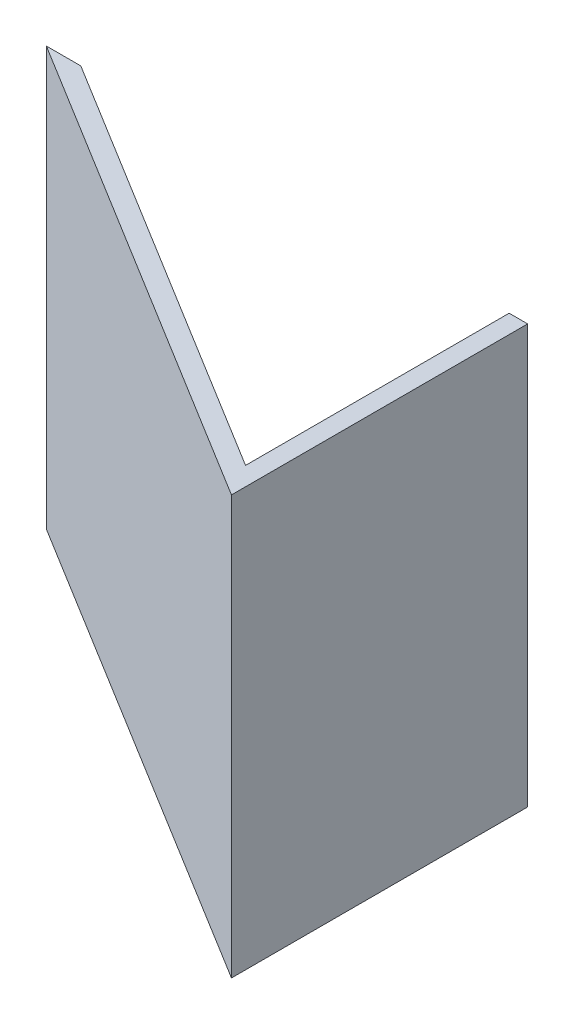
ISO-10303-21;
HEADER;
FILE_DESCRIPTION(('STEP AP214'),'2;1');
FILE_NAME('part.step','',(''),(''),'','','');
FILE_SCHEMA(('AUTOMOTIVE_DESIGN { 1 0 10303 214 1 1 1 1 }'));
ENDSEC;
DATA;
#1=APPLICATION_CONTEXT('core data for automotive mechanical design processes');
#2=APPLICATION_PROTOCOL_DEFINITION('international standard','automotive_design',2000,#1);
#3=PRODUCT_CONTEXT('',#1,'mechanical');
#4=PRODUCT('Part','Part','',(#3));
#5=PRODUCT_RELATED_PRODUCT_CATEGORY('part','',(#4));
#6=PRODUCT_DEFINITION_FORMATION('','',#4);
#7=PRODUCT_DEFINITION_CONTEXT('part definition',#1,'design');
#8=PRODUCT_DEFINITION('design','',#6,#7);
#9=PRODUCT_DEFINITION_SHAPE('','',#8);
#10=(LENGTH_UNIT() NAMED_UNIT(*) SI_UNIT(.MILLI.,.METRE.));
#11=(NAMED_UNIT(*) PLANE_ANGLE_UNIT() SI_UNIT($,.RADIAN.));
#12=(NAMED_UNIT(*) SI_UNIT($,.STERADIAN.) SOLID_ANGLE_UNIT());
#13=UNCERTAINTY_MEASURE_WITH_UNIT(LENGTH_MEASURE(1.E-05),#10,'distance_accuracy_value','');
#14=(GEOMETRIC_REPRESENTATION_CONTEXT(3) GLOBAL_UNCERTAINTY_ASSIGNED_CONTEXT((#13)) GLOBAL_UNIT_ASSIGNED_CONTEXT((#10,
#11,#12)) REPRESENTATION_CONTEXT('',''));
#15=CARTESIAN_POINT('',(0.,0.,0.));
#16=DIRECTION('',(0.,0.,1.));
#17=DIRECTION('',(1.,0.,0.));
#18=AXIS2_PLACEMENT_3D('',#15,#16,#17);
#19=CARTESIAN_POINT('',(-11.6154303992499,71.755,-34.1908451260969));
#20=DIRECTION('',(0.,0.,1.));
#21=DIRECTION('',(1.,0.,0.));
#22=AXIS2_PLACEMENT_3D('',#19,#20,#21);
#23=PLANE('',#22);
#24=DIRECTION('',(-1.,0.,0.));
#25=VECTOR('',#24,1.);
#26=CARTESIAN_POINT('',(-11.6154303992499,0.,-34.1908451260969));
#27=LINE('',#26,#25);
#28=CARTESIAN_POINT('',(-11.6154303992499,0.,-34.1908451260969));
#29=VERTEX_POINT('',#28);
#30=CARTESIAN_POINT('',(-17.522883231876,0.,-34.1908451260969));
#31=VERTEX_POINT('',#30);
#32=EDGE_CURVE('E120',#29,#31,#27,.T.);
#33=ORIENTED_EDGE('',*,*,#32,.T.);
#34=DIRECTION('',(0.,-1.,0.));
#35=VECTOR('',#34,1.);
#36=CARTESIAN_POINT('',(-17.522883231876,71.755,-34.1908451260969));
#37=LINE('',#36,#35);
#38=CARTESIAN_POINT('',(-17.522883231876,71.755,-34.1908451260969));
#39=VERTEX_POINT('',#38);
#40=EDGE_CURVE('E11',#39,#31,#37,.T.);
#41=ORIENTED_EDGE('',*,*,#40,.F.);
#42=DIRECTION('',(-1.,0.,0.));
#43=VECTOR('',#42,1.);
#44=CARTESIAN_POINT('',(-11.6154303992499,71.755,-34.1908451260969));
#45=LINE('',#44,#43);
#46=CARTESIAN_POINT('',(-11.6154303992499,71.755,-34.1908451260969));
#47=VERTEX_POINT('',#46);
#48=EDGE_CURVE('E131',#47,#39,#45,.T.);
#49=ORIENTED_EDGE('',*,*,#48,.F.);
#50=DIRECTION('',(0.,-1.,0.));
#51=VECTOR('',#50,1.);
#52=CARTESIAN_POINT('',(-11.6154303992499,71.755,-34.1908451260969));
#53=LINE('',#52,#51);
#54=EDGE_CURVE('E116',#47,#29,#53,.T.);
#55=ORIENTED_EDGE('',*,*,#54,.T.);
#56=EDGE_LOOP('',(#33,#41,#49,#55));
#57=FACE_BOUND('',#56,.T.);
#58=ADVANCED_FACE('F35',(#57),#23,.F.);
#59=CARTESIAN_POINT('',(-17.522883231876,71.755,-34.1908451260969));
#60=DIRECTION('',(0.524097425664335,0.,-0.851658316704544));
#61=DIRECTION('',(-0.851658316704544,0.,-0.524097425664335));
#62=AXIS2_PLACEMENT_3D('',#59,#60,#61);
#63=PLANE('',#62);
#64=DIRECTION('',(0.851658316704544,0.,0.524097425664335));
#65=VECTOR('',#64,1.);
#66=CARTESIAN_POINT('',(-17.522883231876,0.,-34.1908451260969));
#67=LINE('',#66,#65);
#68=CARTESIAN_POINT('',(65.0271167681239,0.,16.6091548739031));
#69=VERTEX_POINT('',#68);
#70=EDGE_CURVE('E123',#31,#69,#67,.T.);
#71=ORIENTED_EDGE('',*,*,#70,.T.);
#72=DIRECTION('',(0.,-1.,0.));
#73=VECTOR('',#72,1.);
#74=CARTESIAN_POINT('',(65.0271167681239,71.755,16.6091548739031));
#75=LINE('',#74,#73);
#76=CARTESIAN_POINT('',(65.0271167681239,71.755,16.6091548739031));
#77=VERTEX_POINT('',#76);
#78=EDGE_CURVE('E43',#77,#69,#75,.T.);
#79=ORIENTED_EDGE('',*,*,#78,.F.);
#80=DIRECTION('',(0.851658316704544,0.,0.524097425664335));
#81=VECTOR('',#80,1.);
#82=CARTESIAN_POINT('',(-17.522883231876,71.755,-34.1908451260969));
#83=LINE('',#82,#81);
#84=EDGE_CURVE('E85',#39,#77,#83,.T.);
#85=ORIENTED_EDGE('',*,*,#84,.F.);
#86=ORIENTED_EDGE('',*,*,#40,.T.);
#87=EDGE_LOOP('',(#71,#79,#85,#86));
#88=FACE_BOUND('',#87,.T.);
#89=ADVANCED_FACE('F145',(#88),#63,.F.);
#90=CARTESIAN_POINT('',(65.0271167681239,71.755,-34.1908451260969));
#91=DIRECTION('',(-1.,0.,0.));
#92=DIRECTION('',(0.,0.,1.));
#93=AXIS2_PLACEMENT_3D('',#90,#91,#92);
#94=PLANE('',#93);
#95=DIRECTION('',(0.,0.,-1.));
#96=VECTOR('',#95,1.);
#97=CARTESIAN_POINT('',(65.0271167681239,0.,-34.1908451260969));
#98=LINE('',#97,#96);
#99=CARTESIAN_POINT('',(65.0271167681239,0.,-34.1908451260969));
#100=VERTEX_POINT('',#99);
#101=EDGE_CURVE('E125',#69,#100,#98,.T.);
#102=ORIENTED_EDGE('',*,*,#101,.T.);
#103=DIRECTION('',(0.,-1.,0.));
#104=VECTOR('',#103,1.);
#105=CARTESIAN_POINT('',(65.0271167681239,71.755,-34.1908451260969));
#106=LINE('',#105,#104);
#107=CARTESIAN_POINT('',(65.0271167681239,71.755,-34.1908451260969));
#108=VERTEX_POINT('',#107);
#109=EDGE_CURVE('E111',#108,#100,#106,.T.);
#110=ORIENTED_EDGE('',*,*,#109,.F.);
#111=DIRECTION('',(0.,0.,-1.));
#112=VECTOR('',#111,1.);
#113=CARTESIAN_POINT('',(65.0271167681239,71.755,-34.1908451260969));
#114=LINE('',#113,#112);
#115=EDGE_CURVE('E99',#77,#108,#114,.T.);
#116=ORIENTED_EDGE('',*,*,#115,.F.);
#117=ORIENTED_EDGE('',*,*,#78,.T.);
#118=EDGE_LOOP('',(#102,#110,#116,#117));
#119=FACE_BOUND('',#118,.T.);
#120=ADVANCED_FACE('F137',(#119),#94,.F.);
#121=CARTESIAN_POINT('',(65.0271167681239,71.755,-34.1908451260969));
#122=DIRECTION('',(0.,0.,1.));
#123=DIRECTION('',(1.,0.,0.));
#124=AXIS2_PLACEMENT_3D('',#121,#122,#123);
#125=PLANE('',#124);
#126=DIRECTION('',(-1.,0.,0.));
#127=VECTOR('',#126,1.);
#128=CARTESIAN_POINT('',(65.0271167681239,0.,-34.1908451260969));
#129=LINE('',#128,#127);
#130=CARTESIAN_POINT('',(61.8521167681239,0.,-34.1908451260969));
#131=VERTEX_POINT('',#130);
#132=EDGE_CURVE('E109',#100,#131,#129,.T.);
#133=ORIENTED_EDGE('',*,*,#132,.T.);
#134=DIRECTION('',(0.,-1.,0.));
#135=VECTOR('',#134,1.);
#136=CARTESIAN_POINT('',(61.8521167681239,71.755,-34.1908451260969));
#137=LINE('',#136,#135);
#138=CARTESIAN_POINT('',(61.8521167681239,71.755,-34.1908451260969));
#139=VERTEX_POINT('',#138);
#140=EDGE_CURVE('E106',#139,#131,#137,.T.);
#141=ORIENTED_EDGE('',*,*,#140,.F.);
#142=DIRECTION('',(-1.,0.,0.));
#143=VECTOR('',#142,1.);
#144=CARTESIAN_POINT('',(65.0271167681239,71.755,-34.1908451260969));
#145=LINE('',#144,#143);
#146=EDGE_CURVE('E92',#108,#139,#145,.T.);
#147=ORIENTED_EDGE('',*,*,#146,.F.);
#148=ORIENTED_EDGE('',*,*,#109,.T.);
#149=EDGE_LOOP('',(#133,#141,#147,#148));
#150=FACE_BOUND('',#149,.T.);
#151=ADVANCED_FACE('F107',(#150),#125,.F.);
#152=CARTESIAN_POINT('',(61.852116768124,71.755,11.0199531307485));
#153=DIRECTION('',(1.,0.,0.));
#154=DIRECTION('',(0.,0.,-1.));
#155=AXIS2_PLACEMENT_3D('',#152,#153,#154);
#156=PLANE('',#155);
#157=DIRECTION('',(0.,0.,1.));
#158=VECTOR('',#157,1.);
#159=CARTESIAN_POINT('',(61.852116768124,0.,11.0199531307485));
#160=LINE('',#159,#158);
#161=CARTESIAN_POINT('',(61.852116768124,0.,11.0199531307485));
#162=VERTEX_POINT('',#161);
#163=EDGE_CURVE('E128',#131,#162,#160,.T.);
#164=ORIENTED_EDGE('',*,*,#163,.T.);
#165=DIRECTION('',(0.,-1.,0.));
#166=VECTOR('',#165,1.);
#167=CARTESIAN_POINT('',(61.852116768124,71.755,11.0199531307485));
#168=LINE('',#167,#166);
#169=CARTESIAN_POINT('',(61.852116768124,71.755,11.0199531307485));
#170=VERTEX_POINT('',#169);
#171=EDGE_CURVE('E112',#170,#162,#168,.T.);
#172=ORIENTED_EDGE('',*,*,#171,.F.);
#173=DIRECTION('',(0.,0.,1.));
#174=VECTOR('',#173,1.);
#175=CARTESIAN_POINT('',(61.8521167681239,71.755,-34.1908451260969));
#176=LINE('',#175,#174);
#177=EDGE_CURVE('E96',#139,#170,#176,.T.);
#178=ORIENTED_EDGE('',*,*,#177,.F.);
#179=ORIENTED_EDGE('',*,*,#140,.T.);
#180=EDGE_LOOP('',(#164,#172,#178,#179));
#181=FACE_BOUND('',#180,.T.);
#182=ADVANCED_FACE('F114',(#181),#156,.F.);
#183=CARTESIAN_POINT('',(-10.9432494602534,71.755,-33.7771953174837));
#184=DIRECTION('',(-0.524097425664295,0.,0.851658316704568));
#185=DIRECTION('',(0.851658316704568,0.,0.524097425664296));
#186=AXIS2_PLACEMENT_3D('',#183,#184,#185);
#187=PLANE('',#186);
#188=DIRECTION('',(-0.851658316704568,0.,-0.524097425664295));
#189=VECTOR('',#188,1.);
#190=CARTESIAN_POINT('',(-10.9432494602534,0.,-33.7771953174837));
#191=LINE('',#190,#189);
#192=EDGE_CURVE('E73',#162,#29,#191,.T.);
#193=ORIENTED_EDGE('',*,*,#192,.T.);
#194=ORIENTED_EDGE('',*,*,#54,.F.);
#195=DIRECTION('',(-0.851658316704568,0.,-0.524097425664296));
#196=VECTOR('',#195,1.);
#197=CARTESIAN_POINT('',(61.5975630397466,71.755,10.8633046825163));
#198=LINE('',#197,#196);
#199=EDGE_CURVE('E51',#170,#47,#198,.T.);
#200=ORIENTED_EDGE('',*,*,#199,.F.);
#201=ORIENTED_EDGE('',*,*,#171,.T.);
#202=EDGE_LOOP('',(#193,#194,#200,#201));
#203=FACE_BOUND('',#202,.T.);
#204=ADVANCED_FACE('F139',(#203),#187,.F.);
#205=CARTESIAN_POINT('',(0.,71.755,0.));
#206=DIRECTION('',(0.,1.,0.));
#207=DIRECTION('',(0.,0.,1.));
#208=AXIS2_PLACEMENT_3D('',#205,#206,#207);
#209=PLANE('',#208);
#210=ORIENTED_EDGE('',*,*,#48,.T.);
#211=ORIENTED_EDGE('',*,*,#84,.T.);
#212=ORIENTED_EDGE('',*,*,#115,.T.);
#213=ORIENTED_EDGE('',*,*,#146,.T.);
#214=ORIENTED_EDGE('',*,*,#177,.T.);
#215=ORIENTED_EDGE('',*,*,#199,.T.);
#216=EDGE_LOOP('',(#210,#211,#212,#213,#214,#215));
#217=FACE_BOUND('',#216,.T.);
#218=ADVANCED_FACE('F94',(#217),#209,.T.);
#219=CARTESIAN_POINT('',(0.,0.,0.));
#220=DIRECTION('',(0.,1.,0.));
#221=DIRECTION('',(0.,0.,1.));
#222=AXIS2_PLACEMENT_3D('',#219,#220,#221);
#223=PLANE('',#222);
#224=ORIENTED_EDGE('',*,*,#32,.F.);
#225=ORIENTED_EDGE('',*,*,#192,.F.);
#226=ORIENTED_EDGE('',*,*,#163,.F.);
#227=ORIENTED_EDGE('',*,*,#132,.F.);
#228=ORIENTED_EDGE('',*,*,#101,.F.);
#229=ORIENTED_EDGE('',*,*,#70,.F.);
#230=EDGE_LOOP('',(#224,#225,#226,#227,#228,#229));
#231=FACE_BOUND('',#230,.T.);
#232=ADVANCED_FACE('F138',(#231),#223,.F.);
#233=CLOSED_SHELL('',(#58,#89,#120,#151,#182,#204,#218,#232));
#234=MANIFOLD_SOLID_BREP('B2',#233);
#235=ADVANCED_BREP_SHAPE_REPRESENTATION('',(#18,#234),#14);
#236=SHAPE_DEFINITION_REPRESENTATION(#9,#235);
ENDSEC;
END-ISO-10303-21;
